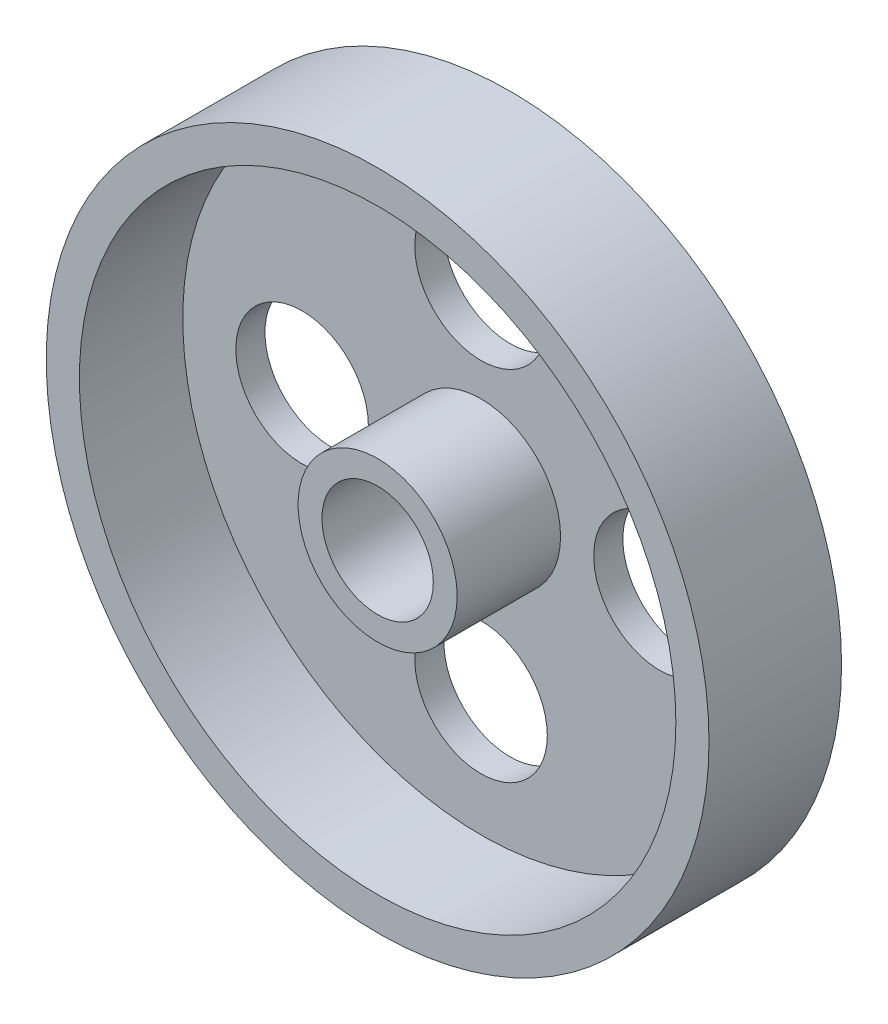
ISO-10303-21;
HEADER;
FILE_DESCRIPTION(('STEP AP214'),'2;1');
FILE_NAME('part.step','',(''),(''),'','','');
FILE_SCHEMA(('AUTOMOTIVE_DESIGN { 1 0 10303 214 1 1 1 1 }'));
ENDSEC;
DATA;
#1=APPLICATION_CONTEXT('core data for automotive mechanical design processes');
#2=APPLICATION_PROTOCOL_DEFINITION('international standard','automotive_design',2000,#1);
#3=PRODUCT_CONTEXT('',#1,'mechanical');
#4=PRODUCT('Part','Part','',(#3));
#5=PRODUCT_RELATED_PRODUCT_CATEGORY('part','',(#4));
#6=PRODUCT_DEFINITION_FORMATION('','',#4);
#7=PRODUCT_DEFINITION_CONTEXT('part definition',#1,'design');
#8=PRODUCT_DEFINITION('design','',#6,#7);
#9=PRODUCT_DEFINITION_SHAPE('','',#8);
#10=(LENGTH_UNIT() NAMED_UNIT(*) SI_UNIT(.MILLI.,.METRE.));
#11=(NAMED_UNIT(*) PLANE_ANGLE_UNIT() SI_UNIT($,.RADIAN.));
#12=(NAMED_UNIT(*) SI_UNIT($,.STERADIAN.) SOLID_ANGLE_UNIT());
#13=UNCERTAINTY_MEASURE_WITH_UNIT(LENGTH_MEASURE(1.E-05),#10,'distance_accuracy_value','');
#14=(GEOMETRIC_REPRESENTATION_CONTEXT(3) GLOBAL_UNCERTAINTY_ASSIGNED_CONTEXT((#13)) GLOBAL_UNIT_ASSIGNED_CONTEXT((#10,
#11,#12)) REPRESENTATION_CONTEXT('',''));
#15=CARTESIAN_POINT('',(0.,0.,0.));
#16=DIRECTION('',(0.,0.,1.));
#17=DIRECTION('',(1.,0.,0.));
#18=AXIS2_PLACEMENT_3D('',#15,#16,#17);
#19=CARTESIAN_POINT('',(0.,0.,2.2));
#20=DIRECTION('',(0.,0.,-1.));
#21=DIRECTION('',(-1.,0.,0.));
#22=AXIS2_PLACEMENT_3D('',#19,#20,#21);
#23=CYLINDRICAL_SURFACE('',#22,25.);
#24=CARTESIAN_POINT('',(0.,0.,0.));
#25=DIRECTION('',(0.,0.,1.));
#26=DIRECTION('',(1.,0.,0.));
#27=AXIS2_PLACEMENT_3D('',#24,#25,#26);
#28=CIRCLE('',#27,25.);
#29=CARTESIAN_POINT('',(25.,0.,0.));
#30=VERTEX_POINT('',#29);
#31=EDGE_CURVE('E44',#30,#30,#28,.T.);
#32=ORIENTED_EDGE('',*,*,#31,.T.);
#33=EDGE_LOOP('',(#32));
#34=FACE_BOUND('',#33,.T.);
#35=CARTESIAN_POINT('',(0.,0.,10.));
#36=DIRECTION('',(0.,0.,1.));
#37=DIRECTION('',(1.,0.,0.));
#38=AXIS2_PLACEMENT_3D('',#35,#36,#37);
#39=CIRCLE('',#38,25.);
#40=CARTESIAN_POINT('',(25.,0.,10.));
#41=VERTEX_POINT('',#40);
#42=EDGE_CURVE('E49',#41,#41,#39,.T.);
#43=ORIENTED_EDGE('',*,*,#42,.F.);
#44=EDGE_LOOP('',(#43));
#45=FACE_BOUND('',#44,.T.);
#46=ADVANCED_FACE('F37',(#34,#45),#23,.T.);
#47=CARTESIAN_POINT('',(0.,0.,0.));
#48=DIRECTION('',(0.,0.,1.));
#49=DIRECTION('',(1.,0.,0.));
#50=AXIS2_PLACEMENT_3D('',#47,#48,#49);
#51=PLANE('',#50);
#52=CARTESIAN_POINT('',(0.,13.5,0.));
#53=DIRECTION('',(0.,0.,1.));
#54=DIRECTION('',(1.,0.,0.));
#55=AXIS2_PLACEMENT_3D('',#52,#53,#54);
#56=CIRCLE('',#55,5.);
#57=CARTESIAN_POINT('',(5.,13.5,0.));
#58=VERTEX_POINT('',#57);
#59=EDGE_CURVE('E67',#58,#58,#56,.F.);
#60=ORIENTED_EDGE('',*,*,#59,.F.);
#61=EDGE_LOOP('',(#60));
#62=FACE_BOUND('',#61,.T.);
#63=CARTESIAN_POINT('',(0.,-13.5,0.));
#64=DIRECTION('',(0.,0.,1.));
#65=DIRECTION('',(1.,0.,0.));
#66=AXIS2_PLACEMENT_3D('',#63,#64,#65);
#67=CIRCLE('',#66,5.);
#68=CARTESIAN_POINT('',(5.,-13.5,0.));
#69=VERTEX_POINT('',#68);
#70=EDGE_CURVE('E64',#69,#69,#67,.F.);
#71=ORIENTED_EDGE('',*,*,#70,.F.);
#72=EDGE_LOOP('',(#71));
#73=FACE_BOUND('',#72,.T.);
#74=CARTESIAN_POINT('',(13.5,0.,0.));
#75=DIRECTION('',(0.,0.,1.));
#76=DIRECTION('',(1.,0.,0.));
#77=AXIS2_PLACEMENT_3D('',#74,#75,#76);
#78=CIRCLE('',#77,5.);
#79=CARTESIAN_POINT('',(18.5,0.,0.));
#80=VERTEX_POINT('',#79);
#81=EDGE_CURVE('E61',#80,#80,#78,.F.);
#82=ORIENTED_EDGE('',*,*,#81,.F.);
#83=EDGE_LOOP('',(#82));
#84=FACE_BOUND('',#83,.T.);
#85=CARTESIAN_POINT('',(-13.5,0.,0.));
#86=DIRECTION('',(0.,0.,1.));
#87=DIRECTION('',(1.,0.,0.));
#88=AXIS2_PLACEMENT_3D('',#85,#86,#87);
#89=CIRCLE('',#88,5.);
#90=CARTESIAN_POINT('',(-8.5,0.,0.));
#91=VERTEX_POINT('',#90);
#92=EDGE_CURVE('E57',#91,#91,#89,.F.);
#93=ORIENTED_EDGE('',*,*,#92,.F.);
#94=EDGE_LOOP('',(#93));
#95=FACE_BOUND('',#94,.T.);
#96=CARTESIAN_POINT('',(0.,0.,0.));
#97=DIRECTION('',(0.,0.,1.));
#98=DIRECTION('',(1.,0.,0.));
#99=AXIS2_PLACEMENT_3D('',#96,#97,#98);
#100=CIRCLE('',#99,4.2);
#101=CARTESIAN_POINT('',(4.2,0.,0.));
#102=VERTEX_POINT('',#101);
#103=EDGE_CURVE('E56',#102,#102,#100,.F.);
#104=ORIENTED_EDGE('',*,*,#103,.F.);
#105=EDGE_LOOP('',(#104));
#106=FACE_BOUND('',#105,.T.);
#107=ORIENTED_EDGE('',*,*,#31,.F.);
#108=EDGE_LOOP('',(#107));
#109=FACE_BOUND('',#108,.T.);
#110=ADVANCED_FACE('F99',(#62,#73,#84,#95,#106,#109),#51,.F.);
#111=CARTESIAN_POINT('',(0.,0.,10.));
#112=DIRECTION('',(0.,0.,1.));
#113=DIRECTION('',(1.,0.,0.));
#114=AXIS2_PLACEMENT_3D('',#111,#112,#113);
#115=PLANE('',#114);
#116=ORIENTED_EDGE('',*,*,#42,.T.);
#117=EDGE_LOOP('',(#116));
#118=FACE_BOUND('',#117,.T.);
#119=CARTESIAN_POINT('',(0.,0.,10.));
#120=DIRECTION('',(0.,0.,1.));
#121=DIRECTION('',(1.,0.,0.));
#122=AXIS2_PLACEMENT_3D('',#119,#120,#121);
#123=CIRCLE('',#122,22.5);
#124=CARTESIAN_POINT('',(22.5,0.,10.));
#125=VERTEX_POINT('',#124);
#126=EDGE_CURVE('E88',#125,#125,#123,.T.);
#127=ORIENTED_EDGE('',*,*,#126,.F.);
#128=EDGE_LOOP('',(#127));
#129=FACE_BOUND('',#128,.T.);
#130=ADVANCED_FACE('F95',(#118,#129),#115,.T.);
#131=CARTESIAN_POINT('',(0.,0.,10.));
#132=DIRECTION('',(0.,0.,-1.));
#133=DIRECTION('',(-1.,0.,0.));
#134=AXIS2_PLACEMENT_3D('',#131,#132,#133);
#135=CYLINDRICAL_SURFACE('',#134,22.5);
#136=ORIENTED_EDGE('',*,*,#126,.T.);
#137=EDGE_LOOP('',(#136));
#138=FACE_BOUND('',#137,.T.);
#139=CARTESIAN_POINT('',(0.,0.,2.2));
#140=DIRECTION('',(0.,0.,1.));
#141=DIRECTION('',(1.,0.,0.));
#142=AXIS2_PLACEMENT_3D('',#139,#140,#141);
#143=CIRCLE('',#142,22.5);
#144=CARTESIAN_POINT('',(22.5,0.,2.2));
#145=VERTEX_POINT('',#144);
#146=EDGE_CURVE('E10',#145,#145,#143,.F.);
#147=ORIENTED_EDGE('',*,*,#146,.T.);
#148=EDGE_LOOP('',(#147));
#149=FACE_BOUND('',#148,.T.);
#150=ADVANCED_FACE('F112',(#138,#149),#135,.F.);
#151=CARTESIAN_POINT('',(0.,0.,2.2));
#152=DIRECTION('',(0.,0.,1.));
#153=DIRECTION('',(1.,0.,0.));
#154=AXIS2_PLACEMENT_3D('',#151,#152,#153);
#155=PLANE('',#154);
#156=CARTESIAN_POINT('',(0.,13.5,2.2));
#157=DIRECTION('',(0.,0.,1.));
#158=DIRECTION('',(1.,0.,0.));
#159=AXIS2_PLACEMENT_3D('',#156,#157,#158);
#160=CIRCLE('',#159,5.);
#161=CARTESIAN_POINT('',(5.,13.5,2.2));
#162=VERTEX_POINT('',#161);
#163=EDGE_CURVE('E40',#162,#162,#160,.F.);
#164=ORIENTED_EDGE('',*,*,#163,.T.);
#165=EDGE_LOOP('',(#164));
#166=FACE_BOUND('',#165,.T.);
#167=CARTESIAN_POINT('',(0.,-13.5,2.2));
#168=DIRECTION('',(0.,0.,1.));
#169=DIRECTION('',(1.,0.,0.));
#170=AXIS2_PLACEMENT_3D('',#167,#168,#169);
#171=CIRCLE('',#170,5.);
#172=CARTESIAN_POINT('',(5.,-13.5,2.2));
#173=VERTEX_POINT('',#172);
#174=EDGE_CURVE('E65',#173,#173,#171,.F.);
#175=ORIENTED_EDGE('',*,*,#174,.T.);
#176=EDGE_LOOP('',(#175));
#177=FACE_BOUND('',#176,.T.);
#178=CARTESIAN_POINT('',(13.5,0.,2.2));
#179=DIRECTION('',(0.,0.,1.));
#180=DIRECTION('',(1.,0.,0.));
#181=AXIS2_PLACEMENT_3D('',#178,#179,#180);
#182=CIRCLE('',#181,5.);
#183=CARTESIAN_POINT('',(18.5,0.,2.2));
#184=VERTEX_POINT('',#183);
#185=EDGE_CURVE('E62',#184,#184,#182,.F.);
#186=ORIENTED_EDGE('',*,*,#185,.T.);
#187=EDGE_LOOP('',(#186));
#188=FACE_BOUND('',#187,.T.);
#189=CARTESIAN_POINT('',(-13.5,0.,2.2));
#190=DIRECTION('',(0.,0.,1.));
#191=DIRECTION('',(1.,0.,0.));
#192=AXIS2_PLACEMENT_3D('',#189,#190,#191);
#193=CIRCLE('',#192,5.);
#194=CARTESIAN_POINT('',(-8.5,0.,2.2));
#195=VERTEX_POINT('',#194);
#196=EDGE_CURVE('E58',#195,#195,#193,.F.);
#197=ORIENTED_EDGE('',*,*,#196,.T.);
#198=EDGE_LOOP('',(#197));
#199=FACE_BOUND('',#198,.T.);
#200=CARTESIAN_POINT('',(0.,0.,2.2));
#201=DIRECTION('',(0.,0.,1.));
#202=DIRECTION('',(1.,0.,0.));
#203=AXIS2_PLACEMENT_3D('',#200,#201,#202);
#204=CIRCLE('',#203,6.);
#205=CARTESIAN_POINT('',(6.,0.,2.2));
#206=VERTEX_POINT('',#205);
#207=EDGE_CURVE('E84',#206,#206,#204,.T.);
#208=ORIENTED_EDGE('',*,*,#207,.F.);
#209=EDGE_LOOP('',(#208));
#210=FACE_BOUND('',#209,.T.);
#211=ORIENTED_EDGE('',*,*,#146,.F.);
#212=EDGE_LOOP('',(#211));
#213=FACE_BOUND('',#212,.T.);
#214=ADVANCED_FACE('F116',(#166,#177,#188,#199,#210,#213),#155,.T.);
#215=CARTESIAN_POINT('',(0.,0.,10.));
#216=DIRECTION('',(0.,0.,-1.));
#217=DIRECTION('',(-1.,0.,0.));
#218=AXIS2_PLACEMENT_3D('',#215,#216,#217);
#219=CYLINDRICAL_SURFACE('',#218,6.);
#220=CARTESIAN_POINT('',(0.,0.,10.));
#221=DIRECTION('',(0.,0.,1.));
#222=DIRECTION('',(1.,0.,0.));
#223=AXIS2_PLACEMENT_3D('',#220,#221,#222);
#224=CIRCLE('',#223,6.);
#225=CARTESIAN_POINT('',(6.,0.,10.));
#226=VERTEX_POINT('',#225);
#227=EDGE_CURVE('E85',#226,#226,#224,.T.);
#228=ORIENTED_EDGE('',*,*,#227,.F.);
#229=EDGE_LOOP('',(#228));
#230=FACE_BOUND('',#229,.T.);
#231=ORIENTED_EDGE('',*,*,#207,.T.);
#232=EDGE_LOOP('',(#231));
#233=FACE_BOUND('',#232,.T.);
#234=ADVANCED_FACE('F117',(#230,#233),#219,.T.);
#235=CARTESIAN_POINT('',(0.,0.,10.));
#236=DIRECTION('',(0.,0.,1.));
#237=DIRECTION('',(1.,0.,0.));
#238=AXIS2_PLACEMENT_3D('',#235,#236,#237);
#239=PLANE('',#238);
#240=CARTESIAN_POINT('',(0.,0.,10.));
#241=DIRECTION('',(0.,0.,1.));
#242=DIRECTION('',(1.,0.,0.));
#243=AXIS2_PLACEMENT_3D('',#240,#241,#242);
#244=CIRCLE('',#243,4.2);
#245=CARTESIAN_POINT('',(4.2,0.,10.));
#246=VERTEX_POINT('',#245);
#247=EDGE_CURVE('E53',#246,#246,#244,.F.);
#248=ORIENTED_EDGE('',*,*,#247,.T.);
#249=EDGE_LOOP('',(#248));
#250=FACE_BOUND('',#249,.T.);
#251=ORIENTED_EDGE('',*,*,#227,.T.);
#252=EDGE_LOOP('',(#251));
#253=FACE_BOUND('',#252,.T.);
#254=ADVANCED_FACE('F125',(#250,#253),#239,.T.);
#255=CARTESIAN_POINT('',(0.,0.,10.1));
#256=DIRECTION('',(0.,0.,-1.));
#257=DIRECTION('',(-1.,0.,0.));
#258=AXIS2_PLACEMENT_3D('',#255,#256,#257);
#259=CYLINDRICAL_SURFACE('',#258,4.2);
#260=ORIENTED_EDGE('',*,*,#247,.F.);
#261=EDGE_LOOP('',(#260));
#262=FACE_BOUND('',#261,.T.);
#263=ORIENTED_EDGE('',*,*,#103,.T.);
#264=EDGE_LOOP('',(#263));
#265=FACE_BOUND('',#264,.T.);
#266=ADVANCED_FACE('F129',(#262,#265),#259,.F.);
#267=CARTESIAN_POINT('',(-13.5,0.,10.1));
#268=DIRECTION('',(0.,0.,-1.));
#269=DIRECTION('',(-1.,0.,0.));
#270=AXIS2_PLACEMENT_3D('',#267,#268,#269);
#271=CYLINDRICAL_SURFACE('',#270,5.);
#272=ORIENTED_EDGE('',*,*,#196,.F.);
#273=EDGE_LOOP('',(#272));
#274=FACE_BOUND('',#273,.T.);
#275=ORIENTED_EDGE('',*,*,#92,.T.);
#276=EDGE_LOOP('',(#275));
#277=FACE_BOUND('',#276,.T.);
#278=ADVANCED_FACE('F133',(#274,#277),#271,.F.);
#279=CARTESIAN_POINT('',(13.5,0.,10.1));
#280=DIRECTION('',(0.,0.,-1.));
#281=DIRECTION('',(-1.,0.,0.));
#282=AXIS2_PLACEMENT_3D('',#279,#280,#281);
#283=CYLINDRICAL_SURFACE('',#282,5.);
#284=ORIENTED_EDGE('',*,*,#185,.F.);
#285=EDGE_LOOP('',(#284));
#286=FACE_BOUND('',#285,.T.);
#287=ORIENTED_EDGE('',*,*,#81,.T.);
#288=EDGE_LOOP('',(#287));
#289=FACE_BOUND('',#288,.T.);
#290=ADVANCED_FACE('F137',(#286,#289),#283,.F.);
#291=CARTESIAN_POINT('',(0.,-13.5,10.1));
#292=DIRECTION('',(0.,0.,-1.));
#293=DIRECTION('',(-1.,0.,0.));
#294=AXIS2_PLACEMENT_3D('',#291,#292,#293);
#295=CYLINDRICAL_SURFACE('',#294,5.);
#296=ORIENTED_EDGE('',*,*,#174,.F.);
#297=EDGE_LOOP('',(#296));
#298=FACE_BOUND('',#297,.T.);
#299=ORIENTED_EDGE('',*,*,#70,.T.);
#300=EDGE_LOOP('',(#299));
#301=FACE_BOUND('',#300,.T.);
#302=ADVANCED_FACE('F141',(#298,#301),#295,.F.);
#303=CARTESIAN_POINT('',(0.,13.5,10.1));
#304=DIRECTION('',(0.,0.,-1.));
#305=DIRECTION('',(-1.,0.,0.));
#306=AXIS2_PLACEMENT_3D('',#303,#304,#305);
#307=CYLINDRICAL_SURFACE('',#306,5.);
#308=ORIENTED_EDGE('',*,*,#163,.F.);
#309=EDGE_LOOP('',(#308));
#310=FACE_BOUND('',#309,.T.);
#311=ORIENTED_EDGE('',*,*,#59,.T.);
#312=EDGE_LOOP('',(#311));
#313=FACE_BOUND('',#312,.T.);
#314=ADVANCED_FACE('F144',(#310,#313),#307,.F.);
#315=CLOSED_SHELL('',(#46,#110,#130,#150,#214,#234,#254,#266,#278,#290,#302,#314));
#316=MANIFOLD_SOLID_BREP('B2',#315);
#317=ADVANCED_BREP_SHAPE_REPRESENTATION('',(#18,#316),#14);
#318=SHAPE_DEFINITION_REPRESENTATION(#9,#317);
ENDSEC;
END-ISO-10303-21;
